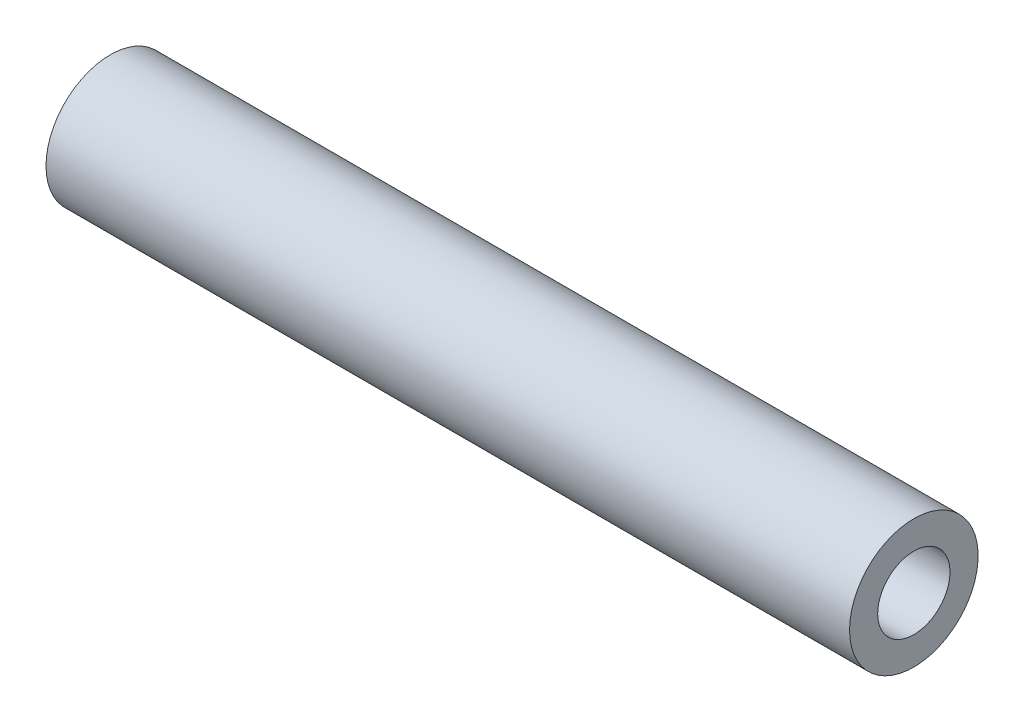
ISO-10303-21;
HEADER;
FILE_DESCRIPTION(('STEP AP214'),'2;1');
FILE_NAME('part.step','',(''),(''),'','','');
FILE_SCHEMA(('AUTOMOTIVE_DESIGN { 1 0 10303 214 1 1 1 1 }'));
ENDSEC;
DATA;
#1=APPLICATION_CONTEXT('core data for automotive mechanical design processes');
#2=APPLICATION_PROTOCOL_DEFINITION('international standard','automotive_design',2000,#1);
#3=PRODUCT_CONTEXT('',#1,'mechanical');
#4=PRODUCT('Part','Part','',(#3));
#5=PRODUCT_RELATED_PRODUCT_CATEGORY('part','',(#4));
#6=PRODUCT_DEFINITION_FORMATION('','',#4);
#7=PRODUCT_DEFINITION_CONTEXT('part definition',#1,'design');
#8=PRODUCT_DEFINITION('design','',#6,#7);
#9=PRODUCT_DEFINITION_SHAPE('','',#8);
#10=(LENGTH_UNIT() NAMED_UNIT(*) SI_UNIT(.MILLI.,.METRE.));
#11=(NAMED_UNIT(*) PLANE_ANGLE_UNIT() SI_UNIT($,.RADIAN.));
#12=(NAMED_UNIT(*) SI_UNIT($,.STERADIAN.) SOLID_ANGLE_UNIT());
#13=UNCERTAINTY_MEASURE_WITH_UNIT(LENGTH_MEASURE(1.E-05),#10,'distance_accuracy_value','');
#14=(GEOMETRIC_REPRESENTATION_CONTEXT(3) GLOBAL_UNCERTAINTY_ASSIGNED_CONTEXT((#13)) GLOBAL_UNIT_ASSIGNED_CONTEXT((#10,
#11,#12)) REPRESENTATION_CONTEXT('',''));
#15=CARTESIAN_POINT('',(0.,0.,0.));
#16=DIRECTION('',(0.,0.,1.));
#17=DIRECTION('',(1.,0.,0.));
#18=AXIS2_PLACEMENT_3D('',#15,#16,#17);
#19=CARTESIAN_POINT('',(-51.,0.,1933.205080758));
#20=DIRECTION('',(1.,0.,0.));
#21=DIRECTION('',(0.,0.,1.));
#22=AXIS2_PLACEMENT_3D('',#19,#20,#21);
#23=CYLINDRICAL_SURFACE('',#22,4.5);
#24=DIRECTION('',(1.,0.,0.));
#25=VECTOR('',#24,1.);
#26=CARTESIAN_POINT('',(-51.,0.,1937.705080758));
#27=LINE('',#26,#25);
#28=CARTESIAN_POINT('',(-50.,0.,1937.705080758));
#29=VERTEX_POINT('',#28);
#30=CARTESIAN_POINT('',(50.,0.,1937.705080758));
#31=VERTEX_POINT('',#30);
#32=EDGE_CURVE('E10',#29,#31,#27,.T.);
#33=ORIENTED_EDGE('',*,*,#32,.F.);
#34=CARTESIAN_POINT('',(-50.,0.,1933.205080758));
#35=DIRECTION('',(1.,0.,0.));
#36=DIRECTION('',(0.,0.,1.));
#37=AXIS2_PLACEMENT_3D('',#34,#35,#36);
#38=CIRCLE('',#37,4.5);
#39=EDGE_CURVE('E24',#29,#29,#38,.T.);
#40=ORIENTED_EDGE('',*,*,#39,.F.);
#41=ORIENTED_EDGE('',*,*,#32,.T.);
#42=CARTESIAN_POINT('',(50.,0.,1933.205080758));
#43=DIRECTION('',(1.,0.,0.));
#44=DIRECTION('',(0.,0.,1.));
#45=AXIS2_PLACEMENT_3D('',#42,#43,#44);
#46=CIRCLE('',#45,4.5);
#47=EDGE_CURVE('E67',#31,#31,#46,.T.);
#48=ORIENTED_EDGE('',*,*,#47,.T.);
#49=EDGE_LOOP('',(#33,#40,#41,#48));
#50=FACE_BOUND('',#49,.T.);
#51=ADVANCED_FACE('F16',(#50),#23,.F.);
#52=CARTESIAN_POINT('',(-50.,0.,1933.205080758));
#53=DIRECTION('',(1.,0.,0.));
#54=DIRECTION('',(0.,1.,0.));
#55=AXIS2_PLACEMENT_3D('',#52,#53,#54);
#56=PLANE('',#55);
#57=ORIENTED_EDGE('',*,*,#39,.T.);
#58=EDGE_LOOP('',(#57));
#59=FACE_BOUND('',#58,.T.);
#60=CARTESIAN_POINT('',(-50.,0.,1933.205080758));
#61=DIRECTION('',(1.,0.,0.));
#62=DIRECTION('',(0.,0.,1.));
#63=AXIS2_PLACEMENT_3D('',#60,#61,#62);
#64=CIRCLE('',#63,8.);
#65=CARTESIAN_POINT('',(-50.,0.,1941.205080758));
#66=VERTEX_POINT('',#65);
#67=EDGE_CURVE('E55',#66,#66,#64,.T.);
#68=ORIENTED_EDGE('',*,*,#67,.F.);
#69=EDGE_LOOP('',(#68));
#70=FACE_BOUND('',#69,.T.);
#71=ADVANCED_FACE('F73',(#59,#70),#56,.F.);
#72=CARTESIAN_POINT('',(50.,0.,1933.205080758));
#73=DIRECTION('',(1.,0.,0.));
#74=DIRECTION('',(0.,1.,0.));
#75=AXIS2_PLACEMENT_3D('',#72,#73,#74);
#76=PLANE('',#75);
#77=ORIENTED_EDGE('',*,*,#47,.F.);
#78=EDGE_LOOP('',(#77));
#79=FACE_BOUND('',#78,.T.);
#80=CARTESIAN_POINT('',(50.,0.,1933.205080758));
#81=DIRECTION('',(1.,0.,0.));
#82=DIRECTION('',(0.,0.,1.));
#83=AXIS2_PLACEMENT_3D('',#80,#81,#82);
#84=CIRCLE('',#83,8.);
#85=CARTESIAN_POINT('',(50.,0.,1941.205080758));
#86=VERTEX_POINT('',#85);
#87=EDGE_CURVE('E53',#86,#86,#84,.T.);
#88=ORIENTED_EDGE('',*,*,#87,.T.);
#89=EDGE_LOOP('',(#88));
#90=FACE_BOUND('',#89,.T.);
#91=ADVANCED_FACE('F59',(#79,#90),#76,.T.);
#92=CARTESIAN_POINT('',(-50.,0.,1933.205080758));
#93=DIRECTION('',(1.,0.,0.));
#94=DIRECTION('',(0.,0.,1.));
#95=AXIS2_PLACEMENT_3D('',#92,#93,#94);
#96=CYLINDRICAL_SURFACE('',#95,8.);
#97=ORIENTED_EDGE('',*,*,#87,.F.);
#98=DIRECTION('',(1.,0.,0.));
#99=VECTOR('',#98,1.);
#100=CARTESIAN_POINT('',(-50.,0.,1941.205080758));
#101=LINE('',#100,#99);
#102=EDGE_CURVE('E50',#66,#86,#101,.T.);
#103=ORIENTED_EDGE('',*,*,#102,.F.);
#104=ORIENTED_EDGE('',*,*,#67,.T.);
#105=ORIENTED_EDGE('',*,*,#102,.T.);
#106=EDGE_LOOP('',(#97,#103,#104,#105));
#107=FACE_BOUND('',#106,.T.);
#108=ADVANCED_FACE('F52',(#107),#96,.T.);
#109=CLOSED_SHELL('',(#51,#71,#91,#108));
#110=MANIFOLD_SOLID_BREP('B1',#109);
#111=ADVANCED_BREP_SHAPE_REPRESENTATION('',(#18,#110),#14);
#112=SHAPE_DEFINITION_REPRESENTATION(#9,#111);
ENDSEC;
END-ISO-10303-21;
